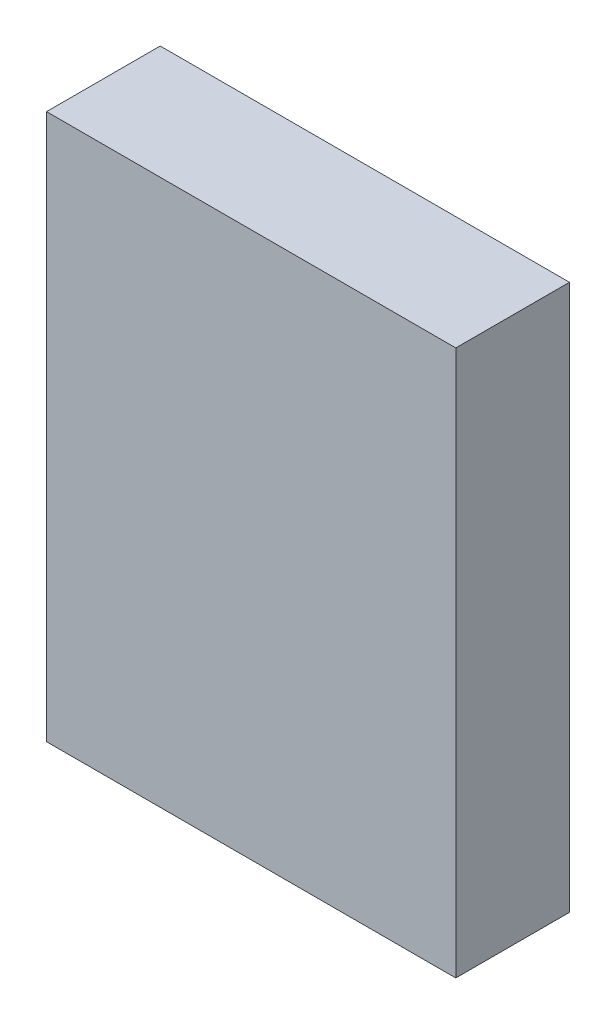
ISO-10303-21;
HEADER;
FILE_DESCRIPTION(('STEP AP214'),'2;1');
FILE_NAME('part.step','',(''),(''),'','','');
FILE_SCHEMA(('AUTOMOTIVE_DESIGN { 1 0 10303 214 1 1 1 1 }'));
ENDSEC;
DATA;
#1=APPLICATION_CONTEXT('core data for automotive mechanical design processes');
#2=APPLICATION_PROTOCOL_DEFINITION('international standard','automotive_design',2000,#1);
#3=PRODUCT_CONTEXT('',#1,'mechanical');
#4=PRODUCT('Part','Part','',(#3));
#5=PRODUCT_RELATED_PRODUCT_CATEGORY('part','',(#4));
#6=PRODUCT_DEFINITION_FORMATION('','',#4);
#7=PRODUCT_DEFINITION_CONTEXT('part definition',#1,'design');
#8=PRODUCT_DEFINITION('design','',#6,#7);
#9=PRODUCT_DEFINITION_SHAPE('','',#8);
#10=(LENGTH_UNIT() NAMED_UNIT(*) SI_UNIT(.MILLI.,.METRE.));
#11=(NAMED_UNIT(*) PLANE_ANGLE_UNIT() SI_UNIT($,.RADIAN.));
#12=(NAMED_UNIT(*) SI_UNIT($,.STERADIAN.) SOLID_ANGLE_UNIT());
#13=UNCERTAINTY_MEASURE_WITH_UNIT(LENGTH_MEASURE(1.E-05),#10,'distance_accuracy_value','');
#14=(GEOMETRIC_REPRESENTATION_CONTEXT(3) GLOBAL_UNCERTAINTY_ASSIGNED_CONTEXT((#13)) GLOBAL_UNIT_ASSIGNED_CONTEXT((#10,
#11,#12)) REPRESENTATION_CONTEXT('',''));
#15=CARTESIAN_POINT('',(0.,0.,0.));
#16=DIRECTION('',(0.,0.,1.));
#17=DIRECTION('',(1.,0.,0.));
#18=AXIS2_PLACEMENT_3D('',#15,#16,#17);
#19=CARTESIAN_POINT('',(-133.774258542876,6.91154832627582,5.));
#20=DIRECTION('',(-1.,0.,0.));
#21=DIRECTION('',(0.,0.,1.));
#22=AXIS2_PLACEMENT_3D('',#19,#20,#21);
#23=PLANE('',#22);
#24=DIRECTION('',(0.,1.,0.));
#25=VECTOR('',#24,1.);
#26=CARTESIAN_POINT('',(-133.774258542876,6.91154832627582,0.));
#27=LINE('',#26,#25);
#28=CARTESIAN_POINT('',(-133.774258542876,-17.0884516737242,0.));
#29=VERTEX_POINT('',#28);
#30=CARTESIAN_POINT('',(-133.774258542876,6.91154832627582,0.));
#31=VERTEX_POINT('',#30);
#32=EDGE_CURVE('E104',#29,#31,#27,.T.);
#33=ORIENTED_EDGE('',*,*,#32,.T.);
#34=DIRECTION('',(0.,0.,-1.));
#35=VECTOR('',#34,1.);
#36=CARTESIAN_POINT('',(-133.774258542876,6.91154832627582,5.));
#37=LINE('',#36,#35);
#38=CARTESIAN_POINT('',(-133.774258542876,6.91154832627582,5.));
#39=VERTEX_POINT('',#38);
#40=EDGE_CURVE('E11',#39,#31,#37,.T.);
#41=ORIENTED_EDGE('',*,*,#40,.F.);
#42=DIRECTION('',(0.,1.,0.));
#43=VECTOR('',#42,1.);
#44=CARTESIAN_POINT('',(-133.774258542876,6.91154832627582,5.));
#45=LINE('',#44,#43);
#46=CARTESIAN_POINT('',(-133.774258542876,-17.0884516737242,5.));
#47=VERTEX_POINT('',#46);
#48=EDGE_CURVE('E92',#47,#39,#45,.T.);
#49=ORIENTED_EDGE('',*,*,#48,.F.);
#50=DIRECTION('',(0.,0.,-1.));
#51=VECTOR('',#50,1.);
#52=CARTESIAN_POINT('',(-133.774258542876,-17.0884516737242,5.));
#53=LINE('',#52,#51);
#54=EDGE_CURVE('E100',#47,#29,#53,.T.);
#55=ORIENTED_EDGE('',*,*,#54,.T.);
#56=EDGE_LOOP('',(#33,#41,#49,#55));
#57=FACE_BOUND('',#56,.T.);
#58=ADVANCED_FACE('F41',(#57),#23,.F.);
#59=CARTESIAN_POINT('',(-151.774258542876,6.91154832627582,5.));
#60=DIRECTION('',(0.,-1.,0.));
#61=DIRECTION('',(1.,0.,0.));
#62=AXIS2_PLACEMENT_3D('',#59,#60,#61);
#63=PLANE('',#62);
#64=DIRECTION('',(-1.,0.,0.));
#65=VECTOR('',#64,1.);
#66=CARTESIAN_POINT('',(-151.774258542876,6.91154832627582,0.));
#67=LINE('',#66,#65);
#68=CARTESIAN_POINT('',(-151.774258542876,6.91154832627582,0.));
#69=VERTEX_POINT('',#68);
#70=EDGE_CURVE('E96',#31,#69,#67,.T.);
#71=ORIENTED_EDGE('',*,*,#70,.T.);
#72=DIRECTION('',(0.,0.,-1.));
#73=VECTOR('',#72,1.);
#74=CARTESIAN_POINT('',(-151.774258542876,6.91154832627582,5.));
#75=LINE('',#74,#73);
#76=CARTESIAN_POINT('',(-151.774258542876,6.91154832627582,5.));
#77=VERTEX_POINT('',#76);
#78=EDGE_CURVE('E49',#77,#69,#75,.T.);
#79=ORIENTED_EDGE('',*,*,#78,.F.);
#80=DIRECTION('',(-1.,0.,0.));
#81=VECTOR('',#80,1.);
#82=CARTESIAN_POINT('',(-151.774258542876,6.91154832627582,5.));
#83=LINE('',#82,#81);
#84=EDGE_CURVE('E87',#39,#77,#83,.T.);
#85=ORIENTED_EDGE('',*,*,#84,.F.);
#86=ORIENTED_EDGE('',*,*,#40,.T.);
#87=EDGE_LOOP('',(#71,#79,#85,#86));
#88=FACE_BOUND('',#87,.T.);
#89=ADVANCED_FACE('F95',(#88),#63,.F.);
#90=CARTESIAN_POINT('',(-151.774258542876,6.91154832627582,5.));
#91=DIRECTION('',(1.,0.,0.));
#92=DIRECTION('',(0.,0.,-1.));
#93=AXIS2_PLACEMENT_3D('',#90,#91,#92);
#94=PLANE('',#93);
#95=DIRECTION('',(0.,-1.,0.));
#96=VECTOR('',#95,1.);
#97=CARTESIAN_POINT('',(-151.774258542876,6.91154832627582,0.));
#98=LINE('',#97,#96);
#99=CARTESIAN_POINT('',(-151.774258542876,-17.0884516737242,0.));
#100=VERTEX_POINT('',#99);
#101=EDGE_CURVE('E74',#69,#100,#98,.T.);
#102=ORIENTED_EDGE('',*,*,#101,.T.);
#103=DIRECTION('',(0.,0.,-1.));
#104=VECTOR('',#103,1.);
#105=CARTESIAN_POINT('',(-151.774258542876,-17.0884516737242,5.));
#106=LINE('',#105,#104);
#107=CARTESIAN_POINT('',(-151.774258542876,-17.0884516737242,5.));
#108=VERTEX_POINT('',#107);
#109=EDGE_CURVE('E97',#108,#100,#106,.T.);
#110=ORIENTED_EDGE('',*,*,#109,.F.);
#111=DIRECTION('',(0.,-1.,0.));
#112=VECTOR('',#111,1.);
#113=CARTESIAN_POINT('',(-151.774258542876,6.91154832627582,5.));
#114=LINE('',#113,#112);
#115=EDGE_CURVE('E90',#77,#108,#114,.T.);
#116=ORIENTED_EDGE('',*,*,#115,.F.);
#117=ORIENTED_EDGE('',*,*,#78,.T.);
#118=EDGE_LOOP('',(#102,#110,#116,#117));
#119=FACE_BOUND('',#118,.T.);
#120=ADVANCED_FACE('F98',(#119),#94,.F.);
#121=CARTESIAN_POINT('',(-151.774258542876,-17.0884516737242,5.));
#122=DIRECTION('',(0.,1.,0.));
#123=DIRECTION('',(0.,0.,1.));
#124=AXIS2_PLACEMENT_3D('',#121,#122,#123);
#125=PLANE('',#124);
#126=DIRECTION('',(1.,0.,0.));
#127=VECTOR('',#126,1.);
#128=CARTESIAN_POINT('',(-151.774258542876,-17.0884516737242,0.));
#129=LINE('',#128,#127);
#130=EDGE_CURVE('E80',#100,#29,#129,.T.);
#131=ORIENTED_EDGE('',*,*,#130,.T.);
#132=ORIENTED_EDGE('',*,*,#54,.F.);
#133=DIRECTION('',(1.,0.,0.));
#134=VECTOR('',#133,1.);
#135=CARTESIAN_POINT('',(-151.774258542876,-17.0884516737242,5.));
#136=LINE('',#135,#134);
#137=EDGE_CURVE('E57',#108,#47,#136,.T.);
#138=ORIENTED_EDGE('',*,*,#137,.F.);
#139=ORIENTED_EDGE('',*,*,#109,.T.);
#140=EDGE_LOOP('',(#131,#132,#138,#139));
#141=FACE_BOUND('',#140,.T.);
#142=ADVANCED_FACE('F111',(#141),#125,.F.);
#143=CARTESIAN_POINT('',(0.,0.,5.));
#144=DIRECTION('',(0.,0.,1.));
#145=DIRECTION('',(1.,0.,0.));
#146=AXIS2_PLACEMENT_3D('',#143,#144,#145);
#147=PLANE('',#146);
#148=ORIENTED_EDGE('',*,*,#48,.T.);
#149=ORIENTED_EDGE('',*,*,#84,.T.);
#150=ORIENTED_EDGE('',*,*,#115,.T.);
#151=ORIENTED_EDGE('',*,*,#137,.T.);
#152=EDGE_LOOP('',(#148,#149,#150,#151));
#153=FACE_BOUND('',#152,.T.);
#154=ADVANCED_FACE('F88',(#153),#147,.T.);
#155=CARTESIAN_POINT('',(0.,0.,0.));
#156=DIRECTION('',(0.,0.,1.));
#157=DIRECTION('',(1.,0.,0.));
#158=AXIS2_PLACEMENT_3D('',#155,#156,#157);
#159=PLANE('',#158);
#160=ORIENTED_EDGE('',*,*,#32,.F.);
#161=ORIENTED_EDGE('',*,*,#130,.F.);
#162=ORIENTED_EDGE('',*,*,#101,.F.);
#163=ORIENTED_EDGE('',*,*,#70,.F.);
#164=EDGE_LOOP('',(#160,#161,#162,#163));
#165=FACE_BOUND('',#164,.T.);
#166=ADVANCED_FACE('F114',(#165),#159,.F.);
#167=CLOSED_SHELL('',(#58,#89,#120,#142,#154,#166));
#168=MANIFOLD_SOLID_BREP('B2',#167);
#169=ADVANCED_BREP_SHAPE_REPRESENTATION('',(#18,#168),#14);
#170=SHAPE_DEFINITION_REPRESENTATION(#9,#169);
ENDSEC;
END-ISO-10303-21;
